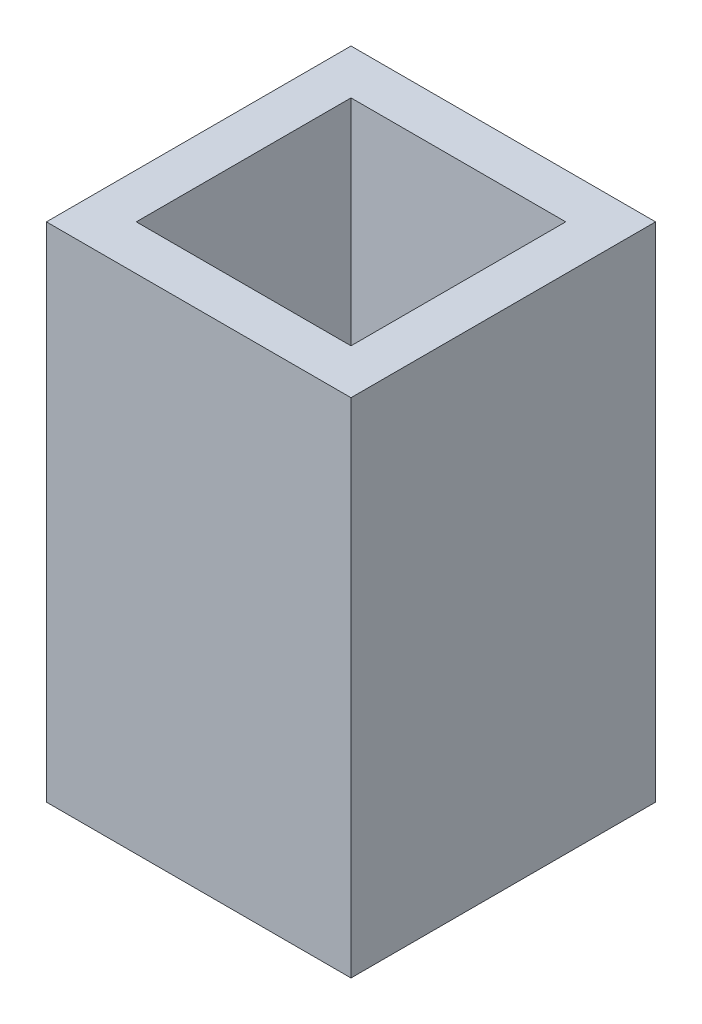
ISO-10303-21;
HEADER;
FILE_DESCRIPTION(('STEP AP214'),'2;1');
FILE_NAME('part.step','',(''),(''),'','','');
FILE_SCHEMA(('AUTOMOTIVE_DESIGN { 1 0 10303 214 1 1 1 1 }'));
ENDSEC;
DATA;
#1=APPLICATION_CONTEXT('core data for automotive mechanical design processes');
#2=APPLICATION_PROTOCOL_DEFINITION('international standard','automotive_design',2000,#1);
#3=PRODUCT_CONTEXT('',#1,'mechanical');
#4=PRODUCT('Part','Part','',(#3));
#5=PRODUCT_RELATED_PRODUCT_CATEGORY('part','',(#4));
#6=PRODUCT_DEFINITION_FORMATION('','',#4);
#7=PRODUCT_DEFINITION_CONTEXT('part definition',#1,'design');
#8=PRODUCT_DEFINITION('design','',#6,#7);
#9=PRODUCT_DEFINITION_SHAPE('','',#8);
#10=(LENGTH_UNIT() NAMED_UNIT(*) SI_UNIT(.MILLI.,.METRE.));
#11=(NAMED_UNIT(*) PLANE_ANGLE_UNIT() SI_UNIT($,.RADIAN.));
#12=(NAMED_UNIT(*) SI_UNIT($,.STERADIAN.) SOLID_ANGLE_UNIT());
#13=UNCERTAINTY_MEASURE_WITH_UNIT(LENGTH_MEASURE(1.E-05),#10,'distance_accuracy_value','');
#14=(GEOMETRIC_REPRESENTATION_CONTEXT(3) GLOBAL_UNCERTAINTY_ASSIGNED_CONTEXT((#13)) GLOBAL_UNIT_ASSIGNED_CONTEXT((#10,
#11,#12)) REPRESENTATION_CONTEXT('',''));
#15=CARTESIAN_POINT('',(0.,0.,0.));
#16=DIRECTION('',(0.,0.,1.));
#17=DIRECTION('',(1.,0.,0.));
#18=AXIS2_PLACEMENT_3D('',#15,#16,#17);
#19=CARTESIAN_POINT('',(-50.000000000001,-308.921356237308,50.0000000000003));
#20=DIRECTION('',(1.,0.,0.));
#21=DIRECTION('',(0.,1.,0.));
#22=AXIS2_PLACEMENT_3D('',#19,#20,#21);
#23=PLANE('',#22);
#24=DIRECTION('',(0.,0.,-1.));
#25=VECTOR('',#24,1.);
#26=CARTESIAN_POINT('',(-50.000000000001,-167.499999999997,50.0000000000002));
#27=LINE('',#26,#25);
#28=CARTESIAN_POINT('',(-50.000000000001,-167.499999999996,50.0000000000002));
#29=VERTEX_POINT('',#28);
#30=CARTESIAN_POINT('',(-50.000000000001,-167.499999999996,-50.0000000000002));
#31=VERTEX_POINT('',#30);
#32=EDGE_CURVE('E159',#29,#31,#27,.T.);
#33=ORIENTED_EDGE('',*,*,#32,.F.);
#34=DIRECTION('',(0.,1.,0.));
#35=VECTOR('',#34,1.);
#36=CARTESIAN_POINT('',(-50.000000000001,-308.921356237308,50.0000000000003));
#37=LINE('',#36,#35);
#38=CARTESIAN_POINT('',(-50.000000000001,-2.49999999999997,50.0000000000002));
#39=VERTEX_POINT('',#38);
#40=EDGE_CURVE('E39',#29,#39,#37,.T.);
#41=ORIENTED_EDGE('',*,*,#40,.T.);
#42=DIRECTION('',(0.,0.,-1.));
#43=VECTOR('',#42,1.);
#44=CARTESIAN_POINT('',(-50.000000000001,-2.49999999999997,50.0000000000002));
#45=LINE('',#44,#43);
#46=CARTESIAN_POINT('',(-50.000000000001,-2.49999999999999,-50.0000000000002));
#47=VERTEX_POINT('',#46);
#48=EDGE_CURVE('E154',#39,#47,#45,.T.);
#49=ORIENTED_EDGE('',*,*,#48,.T.);
#50=DIRECTION('',(0.,1.,0.));
#51=VECTOR('',#50,1.);
#52=CARTESIAN_POINT('',(-50.000000000001,-308.921356237308,-50.0000000000001));
#53=LINE('',#52,#51);
#54=EDGE_CURVE('E153',#31,#47,#53,.T.);
#55=ORIENTED_EDGE('',*,*,#54,.F.);
#56=EDGE_LOOP('',(#33,#41,#49,#55));
#57=FACE_BOUND('',#56,.T.);
#58=ADVANCED_FACE('F35',(#57),#23,.F.);
#59=CARTESIAN_POINT('',(50.000000000001,-308.921356237308,-50.0000000000001));
#60=DIRECTION('',(0.,0.,1.));
#61=DIRECTION('',(0.,-1.,0.));
#62=AXIS2_PLACEMENT_3D('',#59,#60,#61);
#63=PLANE('',#62);
#64=DIRECTION('',(1.,0.,0.));
#65=VECTOR('',#64,1.);
#66=CARTESIAN_POINT('',(50.000000000001,-167.499999999996,-50.0000000000002));
#67=LINE('',#66,#65);
#68=CARTESIAN_POINT('',(50.000000000001,-167.499999999996,-50.0000000000002));
#69=VERTEX_POINT('',#68);
#70=EDGE_CURVE('E44',#31,#69,#67,.T.);
#71=ORIENTED_EDGE('',*,*,#70,.F.);
#72=ORIENTED_EDGE('',*,*,#54,.T.);
#73=DIRECTION('',(1.,0.,0.));
#74=VECTOR('',#73,1.);
#75=CARTESIAN_POINT('',(50.000000000001,-2.49999999999999,-50.0000000000002));
#76=LINE('',#75,#74);
#77=CARTESIAN_POINT('',(50.000000000001,-2.49999999999999,-50.0000000000002));
#78=VERTEX_POINT('',#77);
#79=EDGE_CURVE('E150',#47,#78,#76,.T.);
#80=ORIENTED_EDGE('',*,*,#79,.T.);
#81=DIRECTION('',(0.,1.,0.));
#82=VECTOR('',#81,1.);
#83=CARTESIAN_POINT('',(50.000000000001,-308.921356237308,-50.0000000000001));
#84=LINE('',#83,#82);
#85=EDGE_CURVE('E149',#69,#78,#84,.T.);
#86=ORIENTED_EDGE('',*,*,#85,.F.);
#87=EDGE_LOOP('',(#71,#72,#80,#86));
#88=FACE_BOUND('',#87,.T.);
#89=ADVANCED_FACE('F177',(#88),#63,.F.);
#90=CARTESIAN_POINT('',(50.000000000001,-308.921356237308,50.0000000000003));
#91=DIRECTION('',(-1.,0.,0.));
#92=DIRECTION('',(0.,-1.,0.));
#93=AXIS2_PLACEMENT_3D('',#90,#91,#92);
#94=PLANE('',#93);
#95=DIRECTION('',(0.,0.,1.));
#96=VECTOR('',#95,1.);
#97=CARTESIAN_POINT('',(50.000000000001,-167.499999999996,50.0000000000002));
#98=LINE('',#97,#96);
#99=CARTESIAN_POINT('',(50.000000000001,-167.499999999996,50.0000000000002));
#100=VERTEX_POINT('',#99);
#101=EDGE_CURVE('E11',#69,#100,#98,.T.);
#102=ORIENTED_EDGE('',*,*,#101,.F.);
#103=ORIENTED_EDGE('',*,*,#85,.T.);
#104=DIRECTION('',(0.,0.,1.));
#105=VECTOR('',#104,1.);
#106=CARTESIAN_POINT('',(50.000000000001,-2.49999999999997,50.0000000000002));
#107=LINE('',#106,#105);
#108=CARTESIAN_POINT('',(50.000000000001,-2.49999999999997,50.0000000000002));
#109=VERTEX_POINT('',#108);
#110=EDGE_CURVE('E146',#78,#109,#107,.T.);
#111=ORIENTED_EDGE('',*,*,#110,.T.);
#112=DIRECTION('',(0.,1.,0.));
#113=VECTOR('',#112,1.);
#114=CARTESIAN_POINT('',(50.000000000001,-308.921356237308,50.0000000000003));
#115=LINE('',#114,#113);
#116=EDGE_CURVE('E145',#100,#109,#115,.T.);
#117=ORIENTED_EDGE('',*,*,#116,.F.);
#118=EDGE_LOOP('',(#102,#103,#111,#117));
#119=FACE_BOUND('',#118,.T.);
#120=ADVANCED_FACE('F170',(#119),#94,.F.);
#121=CARTESIAN_POINT('',(50.000000000001,-308.921356237308,50.0000000000003));
#122=DIRECTION('',(0.,0.,-1.));
#123=DIRECTION('',(0.,1.,0.));
#124=AXIS2_PLACEMENT_3D('',#121,#122,#123);
#125=PLANE('',#124);
#126=DIRECTION('',(-1.,0.,0.));
#127=VECTOR('',#126,1.);
#128=CARTESIAN_POINT('',(50.000000000001,-167.499999999996,50.0000000000002));
#129=LINE('',#128,#127);
#130=EDGE_CURVE('E144',#100,#29,#129,.T.);
#131=ORIENTED_EDGE('',*,*,#130,.F.);
#132=ORIENTED_EDGE('',*,*,#116,.T.);
#133=DIRECTION('',(-1.,0.,0.));
#134=VECTOR('',#133,1.);
#135=CARTESIAN_POINT('',(50.000000000001,-2.49999999999997,50.0000000000002));
#136=LINE('',#135,#134);
#137=EDGE_CURVE('E142',#109,#39,#136,.T.);
#138=ORIENTED_EDGE('',*,*,#137,.T.);
#139=ORIENTED_EDGE('',*,*,#40,.F.);
#140=EDGE_LOOP('',(#131,#132,#138,#139));
#141=FACE_BOUND('',#140,.T.);
#142=ADVANCED_FACE('F165',(#141),#125,.F.);
#143=CARTESIAN_POINT('',(0.,-2.49999999999998,0.));
#144=DIRECTION('',(0.,1.,0.));
#145=DIRECTION('',(0.,0.,1.));
#146=AXIS2_PLACEMENT_3D('',#143,#144,#145);
#147=PLANE('',#146);
#148=DIRECTION('',(0.,0.,-1.));
#149=VECTOR('',#148,1.);
#150=CARTESIAN_POINT('',(35.2499999999996,-2.49999999999997,35.2499845423525));
#151=LINE('',#150,#149);
#152=CARTESIAN_POINT('',(35.2499999999996,-2.49999999999997,35.2499845423525));
#153=VERTEX_POINT('',#152);
#154=CARTESIAN_POINT('',(35.2499999999996,-2.49999999999999,-35.2499845423525));
#155=VERTEX_POINT('',#154);
#156=EDGE_CURVE('E52',#153,#155,#151,.T.);
#157=ORIENTED_EDGE('',*,*,#156,.F.);
#158=DIRECTION('',(1.,0.,0.));
#159=VECTOR('',#158,1.);
#160=CARTESIAN_POINT('',(-35.2499999999996,-2.49999999999997,35.2499845423525));
#161=LINE('',#160,#159);
#162=CARTESIAN_POINT('',(-35.2499999999996,-2.49999999999997,35.2499845423525));
#163=VERTEX_POINT('',#162);
#164=EDGE_CURVE('E124',#163,#153,#161,.T.);
#165=ORIENTED_EDGE('',*,*,#164,.F.);
#166=DIRECTION('',(0.,0.,1.));
#167=VECTOR('',#166,1.);
#168=CARTESIAN_POINT('',(-35.2499999999996,-2.49999999999997,35.2499845423525));
#169=LINE('',#168,#167);
#170=CARTESIAN_POINT('',(-35.2499999999996,-2.49999999999999,-35.2499845423525));
#171=VERTEX_POINT('',#170);
#172=EDGE_CURVE('E106',#171,#163,#169,.T.);
#173=ORIENTED_EDGE('',*,*,#172,.F.);
#174=DIRECTION('',(-1.,0.,0.));
#175=VECTOR('',#174,1.);
#176=CARTESIAN_POINT('',(-35.2499999999996,-2.49999999999999,-35.2499845423525));
#177=LINE('',#176,#175);
#178=EDGE_CURVE('E117',#155,#171,#177,.T.);
#179=ORIENTED_EDGE('',*,*,#178,.F.);
#180=EDGE_LOOP('',(#157,#165,#173,#179));
#181=FACE_BOUND('',#180,.T.);
#182=ORIENTED_EDGE('',*,*,#48,.F.);
#183=ORIENTED_EDGE('',*,*,#137,.F.);
#184=ORIENTED_EDGE('',*,*,#110,.F.);
#185=ORIENTED_EDGE('',*,*,#79,.F.);
#186=EDGE_LOOP('',(#182,#183,#184,#185));
#187=FACE_BOUND('',#186,.T.);
#188=ADVANCED_FACE('F121',(#181,#187),#147,.T.);
#189=CARTESIAN_POINT('',(1596.45434384703,-167.499999999996,142.297007376591));
#190=DIRECTION('',(0.,-1.,0.));
#191=DIRECTION('',(1.,0.,0.));
#192=AXIS2_PLACEMENT_3D('',#189,#190,#191);
#193=PLANE('',#192);
#194=ORIENTED_EDGE('',*,*,#130,.T.);
#195=ORIENTED_EDGE('',*,*,#32,.T.);
#196=ORIENTED_EDGE('',*,*,#70,.T.);
#197=ORIENTED_EDGE('',*,*,#101,.T.);
#198=EDGE_LOOP('',(#194,#195,#196,#197));
#199=FACE_BOUND('',#198,.T.);
#200=ADVANCED_FACE('F37',(#199),#193,.T.);
#201=CARTESIAN_POINT('',(35.2499999999996,-2.49999999999997,35.2499845423525));
#202=DIRECTION('',(0.999390827019096,-0.0348994967025011,0.));
#203=DIRECTION('',(0.0348994967025011,0.999390827019096,0.));
#204=AXIS2_PLACEMENT_3D('',#201,#202,#203);
#205=PLANE('',#204);
#206=ORIENTED_EDGE('',*,*,#156,.T.);
#207=DIRECTION('',(0.0348782627423747,0.998782765958718,-0.034878262742375));
#208=VECTOR('',#207,1.);
#209=CARTESIAN_POINT('',(35.164237266167,-4.95592336826402,-35.1642218085199));
#210=LINE('',#209,#208);
#211=CARTESIAN_POINT('',(29.5229938033529,-166.5,-29.5229783457058));
#212=VERTEX_POINT('',#211);
#213=EDGE_CURVE('E114',#212,#155,#210,.T.);
#214=ORIENTED_EDGE('',*,*,#213,.F.);
#215=DIRECTION('',(0.,0.,-1.));
#216=VECTOR('',#215,1.);
#217=CARTESIAN_POINT('',(29.5229938033529,-166.5,35.2499845423525));
#218=LINE('',#217,#216);
#219=CARTESIAN_POINT('',(29.5229938033529,-166.5,29.5229783457059));
#220=VERTEX_POINT('',#219);
#221=EDGE_CURVE('E126',#220,#212,#218,.T.);
#222=ORIENTED_EDGE('',*,*,#221,.F.);
#223=DIRECTION('',(0.0348782627423747,0.998782765958718,0.0348782627423744));
#224=VECTOR('',#223,1.);
#225=CARTESIAN_POINT('',(35.1642372285588,-4.95592444522325,35.1642217709117));
#226=LINE('',#225,#224);
#227=EDGE_CURVE('E130',#220,#153,#226,.T.);
#228=ORIENTED_EDGE('',*,*,#227,.T.);
#229=EDGE_LOOP('',(#206,#214,#222,#228));
#230=FACE_BOUND('',#229,.T.);
#231=ADVANCED_FACE('F193',(#230),#205,.F.);
#232=CARTESIAN_POINT('',(-35.2499999999996,-2.49999999999997,35.2499845423525));
#233=DIRECTION('',(0.,-0.0348994967025008,0.999390827019096));
#234=DIRECTION('',(0.,-0.999390827019096,-0.0348994967025008));
#235=AXIS2_PLACEMENT_3D('',#232,#233,#234);
#236=PLANE('',#235);
#237=ORIENTED_EDGE('',*,*,#164,.T.);
#238=ORIENTED_EDGE('',*,*,#227,.F.);
#239=DIRECTION('',(1.,0.,0.));
#240=VECTOR('',#239,1.);
#241=CARTESIAN_POINT('',(-35.2499999999996,-166.5,29.5229783457059));
#242=LINE('',#241,#240);
#243=CARTESIAN_POINT('',(-29.522993803353,-166.5,29.5229783457059));
#244=VERTEX_POINT('',#243);
#245=EDGE_CURVE('E132',#244,#220,#242,.T.);
#246=ORIENTED_EDGE('',*,*,#245,.F.);
#247=DIRECTION('',(-0.0348782627423747,0.998782765958718,0.0348782627423744));
#248=VECTOR('',#247,1.);
#249=CARTESIAN_POINT('',(-35.2499999999996,-2.49999999999997,35.2499845423525));
#250=LINE('',#249,#248);
#251=EDGE_CURVE('E113',#244,#163,#250,.T.);
#252=ORIENTED_EDGE('',*,*,#251,.T.);
#253=EDGE_LOOP('',(#237,#238,#246,#252));
#254=FACE_BOUND('',#253,.T.);
#255=ADVANCED_FACE('F190',(#254),#236,.F.);
#256=CARTESIAN_POINT('',(-35.2499999999996,-2.49999999999997,35.2499845423525));
#257=DIRECTION('',(-0.999390827019096,-0.034899496702501,0.));
#258=DIRECTION('',(0.034899496702501,-0.999390827019096,0.));
#259=AXIS2_PLACEMENT_3D('',#256,#257,#258);
#260=PLANE('',#259);
#261=ORIENTED_EDGE('',*,*,#172,.T.);
#262=ORIENTED_EDGE('',*,*,#251,.F.);
#263=DIRECTION('',(0.,0.,1.));
#264=VECTOR('',#263,1.);
#265=CARTESIAN_POINT('',(-29.522993803353,-166.5,35.2499845423525));
#266=LINE('',#265,#264);
#267=CARTESIAN_POINT('',(-29.522993803353,-166.5,-29.5229783457058));
#268=VERTEX_POINT('',#267);
#269=EDGE_CURVE('E109',#268,#244,#266,.T.);
#270=ORIENTED_EDGE('',*,*,#269,.F.);
#271=DIRECTION('',(-0.0348782627423747,0.998782765958718,-0.034878262742375));
#272=VECTOR('',#271,1.);
#273=CARTESIAN_POINT('',(-35.2499999999996,-2.49999999999999,-35.2499845423525));
#274=LINE('',#273,#272);
#275=EDGE_CURVE('E102',#268,#171,#274,.T.);
#276=ORIENTED_EDGE('',*,*,#275,.T.);
#277=EDGE_LOOP('',(#261,#262,#270,#276));
#278=FACE_BOUND('',#277,.T.);
#279=ADVANCED_FACE('F104',(#278),#260,.F.);
#280=CARTESIAN_POINT('',(-35.2499999999996,-2.49999999999999,-35.2499845423525));
#281=DIRECTION('',(0.,-0.0348994967025013,-0.999390827019096));
#282=DIRECTION('',(0.,0.999390827019096,-0.0348994967025013));
#283=AXIS2_PLACEMENT_3D('',#280,#281,#282);
#284=PLANE('',#283);
#285=ORIENTED_EDGE('',*,*,#178,.T.);
#286=ORIENTED_EDGE('',*,*,#275,.F.);
#287=DIRECTION('',(-1.,0.,0.));
#288=VECTOR('',#287,1.);
#289=CARTESIAN_POINT('',(-35.2499999999996,-166.5,-29.5229783457058));
#290=LINE('',#289,#288);
#291=EDGE_CURVE('E137',#212,#268,#290,.T.);
#292=ORIENTED_EDGE('',*,*,#291,.F.);
#293=ORIENTED_EDGE('',*,*,#213,.T.);
#294=EDGE_LOOP('',(#285,#286,#292,#293));
#295=FACE_BOUND('',#294,.T.);
#296=ADVANCED_FACE('F118',(#295),#284,.F.);
#297=CARTESIAN_POINT('',(0.,-166.5,0.));
#298=DIRECTION('',(0.,-1.,0.));
#299=DIRECTION('',(0.,0.,-1.));
#300=AXIS2_PLACEMENT_3D('',#297,#298,#299);
#301=PLANE('',#300);
#302=ORIENTED_EDGE('',*,*,#221,.T.);
#303=ORIENTED_EDGE('',*,*,#291,.T.);
#304=ORIENTED_EDGE('',*,*,#269,.T.);
#305=ORIENTED_EDGE('',*,*,#245,.T.);
#306=EDGE_LOOP('',(#302,#303,#304,#305));
#307=FACE_BOUND('',#306,.T.);
#308=ADVANCED_FACE('F199',(#307),#301,.F.);
#309=CLOSED_SHELL('',(#58,#89,#120,#142,#188,#200,#231,#255,#279,#296,#308));
#310=MANIFOLD_SOLID_BREP('B2',#309);
#311=ADVANCED_BREP_SHAPE_REPRESENTATION('',(#18,#310),#14);
#312=SHAPE_DEFINITION_REPRESENTATION(#9,#311);
ENDSEC;
END-ISO-10303-21;
